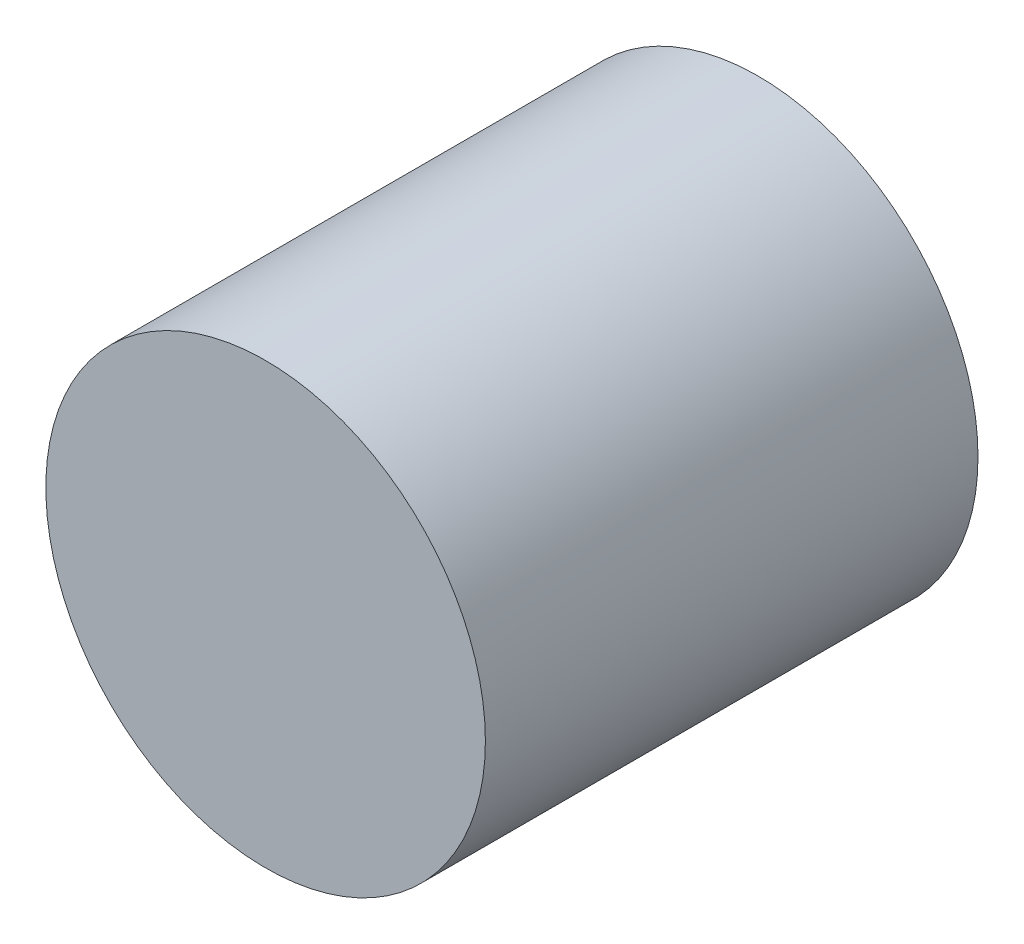
ISO-10303-21;
HEADER;
FILE_DESCRIPTION(('STEP AP214'),'2;1');
FILE_NAME('part.step','',(''),(''),'','','');
FILE_SCHEMA(('AUTOMOTIVE_DESIGN { 1 0 10303 214 1 1 1 1 }'));
ENDSEC;
DATA;
#1=APPLICATION_CONTEXT('core data for automotive mechanical design processes');
#2=APPLICATION_PROTOCOL_DEFINITION('international standard','automotive_design',2000,#1);
#3=PRODUCT_CONTEXT('',#1,'mechanical');
#4=PRODUCT('Part','Part','',(#3));
#5=PRODUCT_RELATED_PRODUCT_CATEGORY('part','',(#4));
#6=PRODUCT_DEFINITION_FORMATION('','',#4);
#7=PRODUCT_DEFINITION_CONTEXT('part definition',#1,'design');
#8=PRODUCT_DEFINITION('design','',#6,#7);
#9=PRODUCT_DEFINITION_SHAPE('','',#8);
#10=(LENGTH_UNIT() NAMED_UNIT(*) SI_UNIT(.MILLI.,.METRE.));
#11=(NAMED_UNIT(*) PLANE_ANGLE_UNIT() SI_UNIT($,.RADIAN.));
#12=(NAMED_UNIT(*) SI_UNIT($,.STERADIAN.) SOLID_ANGLE_UNIT());
#13=UNCERTAINTY_MEASURE_WITH_UNIT(LENGTH_MEASURE(1.E-05),#10,'distance_accuracy_value','');
#14=(GEOMETRIC_REPRESENTATION_CONTEXT(3) GLOBAL_UNCERTAINTY_ASSIGNED_CONTEXT((#13)) GLOBAL_UNIT_ASSIGNED_CONTEXT((#10,
#11,#12)) REPRESENTATION_CONTEXT('',''));
#15=CARTESIAN_POINT('',(0.,0.,0.));
#16=DIRECTION('',(0.,0.,1.));
#17=DIRECTION('',(1.,0.,0.));
#18=AXIS2_PLACEMENT_3D('',#15,#16,#17);
#19=CARTESIAN_POINT('',(0.,0.,6.));
#20=DIRECTION('',(0.,0.,-1.));
#21=DIRECTION('',(-1.,0.,0.));
#22=AXIS2_PLACEMENT_3D('',#19,#20,#21);
#23=CYLINDRICAL_SURFACE('',#22,2.9);
#24=CARTESIAN_POINT('',(0.,0.,0.));
#25=DIRECTION('',(0.,0.,1.));
#26=DIRECTION('',(1.,0.,0.));
#27=AXIS2_PLACEMENT_3D('',#24,#25,#26);
#28=CIRCLE('',#27,2.9);
#29=CARTESIAN_POINT('',(2.9,0.,0.));
#30=VERTEX_POINT('',#29);
#31=EDGE_CURVE('E10',#30,#30,#28,.T.);
#32=ORIENTED_EDGE('',*,*,#31,.T.);
#33=EDGE_LOOP('',(#32));
#34=FACE_BOUND('',#33,.T.);
#35=CARTESIAN_POINT('',(0.,0.,6.5));
#36=DIRECTION('',(0.,0.,1.));
#37=DIRECTION('',(1.,0.,0.));
#38=AXIS2_PLACEMENT_3D('',#35,#36,#37);
#39=CIRCLE('',#38,2.9);
#40=CARTESIAN_POINT('',(2.9,0.,6.5));
#41=VERTEX_POINT('',#40);
#42=EDGE_CURVE('E61',#41,#41,#39,.T.);
#43=ORIENTED_EDGE('',*,*,#42,.F.);
#44=EDGE_LOOP('',(#43));
#45=FACE_BOUND('',#44,.T.);
#46=ADVANCED_FACE('F43',(#34,#45),#23,.T.);
#47=CARTESIAN_POINT('',(0.,0.,0.));
#48=DIRECTION('',(0.,0.,1.));
#49=DIRECTION('',(1.,0.,0.));
#50=AXIS2_PLACEMENT_3D('',#47,#48,#49);
#51=PLANE('',#50);
#52=CARTESIAN_POINT('',(0.,0.,0.));
#53=DIRECTION('',(0.,0.,1.));
#54=DIRECTION('',(1.,0.,0.));
#55=AXIS2_PLACEMENT_3D('',#52,#53,#54);
#56=CIRCLE('',#55,1.6);
#57=CARTESIAN_POINT('',(1.6,0.,0.));
#58=VERTEX_POINT('',#57);
#59=EDGE_CURVE('E50',#58,#58,#56,.T.);
#60=ORIENTED_EDGE('',*,*,#59,.T.);
#61=EDGE_LOOP('',(#60));
#62=FACE_BOUND('',#61,.T.);
#63=ORIENTED_EDGE('',*,*,#31,.F.);
#64=EDGE_LOOP('',(#63));
#65=FACE_BOUND('',#64,.T.);
#66=ADVANCED_FACE('F70',(#62,#65),#51,.F.);
#67=CARTESIAN_POINT('',(0.,0.,0.));
#68=DIRECTION('',(0.,0.,1.));
#69=DIRECTION('',(1.,0.,0.));
#70=AXIS2_PLACEMENT_3D('',#67,#68,#69);
#71=CYLINDRICAL_SURFACE('',#70,1.6);
#72=ORIENTED_EDGE('',*,*,#59,.F.);
#73=EDGE_LOOP('',(#72));
#74=FACE_BOUND('',#73,.T.);
#75=CARTESIAN_POINT('',(0.,0.,6.));
#76=DIRECTION('',(0.,0.,1.));
#77=DIRECTION('',(1.,0.,0.));
#78=AXIS2_PLACEMENT_3D('',#75,#76,#77);
#79=CIRCLE('',#78,1.6);
#80=CARTESIAN_POINT('',(1.6,0.,6.));
#81=VERTEX_POINT('',#80);
#82=EDGE_CURVE('E55',#81,#81,#79,.T.);
#83=ORIENTED_EDGE('',*,*,#82,.T.);
#84=EDGE_LOOP('',(#83));
#85=FACE_BOUND('',#84,.T.);
#86=ADVANCED_FACE('F76',(#74,#85),#71,.F.);
#87=CARTESIAN_POINT('',(0.,0.,6.));
#88=DIRECTION('',(0.,0.,1.));
#89=DIRECTION('',(1.,0.,0.));
#90=AXIS2_PLACEMENT_3D('',#87,#88,#89);
#91=PLANE('',#90);
#92=ORIENTED_EDGE('',*,*,#82,.F.);
#93=EDGE_LOOP('',(#92));
#94=FACE_BOUND('',#93,.T.);
#95=ADVANCED_FACE('F79',(#94),#91,.F.);
#96=CARTESIAN_POINT('',(0.,0.,6.5));
#97=DIRECTION('',(0.,0.,1.));
#98=DIRECTION('',(1.,0.,0.));
#99=AXIS2_PLACEMENT_3D('',#96,#97,#98);
#100=PLANE('',#99);
#101=ORIENTED_EDGE('',*,*,#42,.T.);
#102=EDGE_LOOP('',(#101));
#103=FACE_BOUND('',#102,.T.);
#104=ADVANCED_FACE('F67',(#103),#100,.T.);
#105=CLOSED_SHELL('',(#46,#66,#86,#95,#104));
#106=MANIFOLD_SOLID_BREP('B2',#105);
#107=ADVANCED_BREP_SHAPE_REPRESENTATION('',(#18,#106),#14);
#108=SHAPE_DEFINITION_REPRESENTATION(#9,#107);
ENDSEC;
END-ISO-10303-21;
